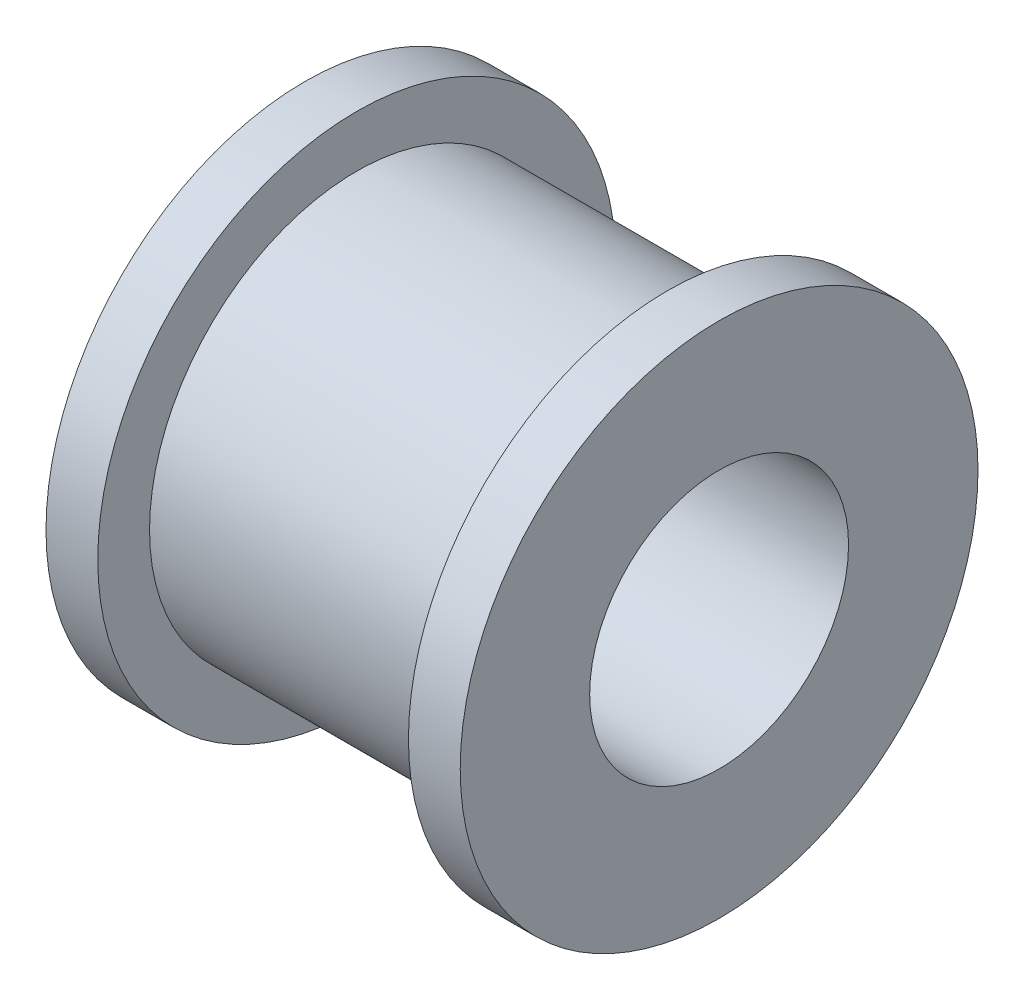
ISO-10303-21;
HEADER;
FILE_DESCRIPTION(('STEP AP214'),'2;1');
FILE_NAME('part.step','',(''),(''),'','','');
FILE_SCHEMA(('AUTOMOTIVE_DESIGN { 1 0 10303 214 1 1 1 1 }'));
ENDSEC;
DATA;
#1=APPLICATION_CONTEXT('core data for automotive mechanical design processes');
#2=APPLICATION_PROTOCOL_DEFINITION('international standard','automotive_design',2000,#1);
#3=PRODUCT_CONTEXT('',#1,'mechanical');
#4=PRODUCT('Part','Part','',(#3));
#5=PRODUCT_RELATED_PRODUCT_CATEGORY('part','',(#4));
#6=PRODUCT_DEFINITION_FORMATION('','',#4);
#7=PRODUCT_DEFINITION_CONTEXT('part definition',#1,'design');
#8=PRODUCT_DEFINITION('design','',#6,#7);
#9=PRODUCT_DEFINITION_SHAPE('','',#8);
#10=(LENGTH_UNIT() NAMED_UNIT(*) SI_UNIT(.MILLI.,.METRE.));
#11=(NAMED_UNIT(*) PLANE_ANGLE_UNIT() SI_UNIT($,.RADIAN.));
#12=(NAMED_UNIT(*) SI_UNIT($,.STERADIAN.) SOLID_ANGLE_UNIT());
#13=UNCERTAINTY_MEASURE_WITH_UNIT(LENGTH_MEASURE(1.E-05),#10,'distance_accuracy_value','');
#14=(GEOMETRIC_REPRESENTATION_CONTEXT(3) GLOBAL_UNCERTAINTY_ASSIGNED_CONTEXT((#13)) GLOBAL_UNIT_ASSIGNED_CONTEXT((#10,
#11,#12)) REPRESENTATION_CONTEXT('',''));
#15=CARTESIAN_POINT('',(0.,0.,0.));
#16=DIRECTION('',(0.,0.,1.));
#17=DIRECTION('',(1.,0.,0.));
#18=AXIS2_PLACEMENT_3D('',#15,#16,#17);
#19=CARTESIAN_POINT('',(8.,0.,0.));
#20=DIRECTION('',(-1.,0.,0.));
#21=DIRECTION('',(0.,0.,1.));
#22=AXIS2_PLACEMENT_3D('',#19,#20,#21);
#23=CYLINDRICAL_SURFACE('',#22,5.);
#24=CARTESIAN_POINT('',(0.,0.,0.));
#25=DIRECTION('',(1.,0.,0.));
#26=DIRECTION('',(0.,0.,-1.));
#27=AXIS2_PLACEMENT_3D('',#24,#25,#26);
#28=CIRCLE('',#27,5.);
#29=CARTESIAN_POINT('',(0.,0.,-5.));
#30=VERTEX_POINT('',#29);
#31=EDGE_CURVE('E45',#30,#30,#28,.T.);
#32=ORIENTED_EDGE('',*,*,#31,.T.);
#33=EDGE_LOOP('',(#32));
#34=FACE_BOUND('',#33,.T.);
#35=CARTESIAN_POINT('',(1.,0.,0.));
#36=DIRECTION('',(1.,0.,0.));
#37=DIRECTION('',(0.,0.,-1.));
#38=AXIS2_PLACEMENT_3D('',#35,#36,#37);
#39=CIRCLE('',#38,5.);
#40=CARTESIAN_POINT('',(1.,0.,-5.));
#41=VERTEX_POINT('',#40);
#42=EDGE_CURVE('E60',#41,#41,#39,.T.);
#43=ORIENTED_EDGE('',*,*,#42,.F.);
#44=EDGE_LOOP('',(#43));
#45=FACE_BOUND('',#44,.T.);
#46=ADVANCED_FACE('F41',(#34,#45),#23,.T.);
#47=CARTESIAN_POINT('',(8.,0.,0.));
#48=DIRECTION('',(1.,0.,0.));
#49=DIRECTION('',(0.,0.,-1.));
#50=AXIS2_PLACEMENT_3D('',#47,#48,#49);
#51=PLANE('',#50);
#52=CARTESIAN_POINT('',(8.,0.,0.));
#53=DIRECTION('',(1.,0.,0.));
#54=DIRECTION('',(0.,0.,-1.));
#55=AXIS2_PLACEMENT_3D('',#52,#53,#54);
#56=CIRCLE('',#55,5.);
#57=CARTESIAN_POINT('',(8.,0.,-5.));
#58=VERTEX_POINT('',#57);
#59=EDGE_CURVE('E10',#58,#58,#56,.T.);
#60=ORIENTED_EDGE('',*,*,#59,.T.);
#61=EDGE_LOOP('',(#60));
#62=FACE_BOUND('',#61,.T.);
#63=CARTESIAN_POINT('',(8.,0.,0.));
#64=DIRECTION('',(1.,0.,0.));
#65=DIRECTION('',(0.,0.,-1.));
#66=AXIS2_PLACEMENT_3D('',#63,#64,#65);
#67=CIRCLE('',#66,2.5);
#68=CARTESIAN_POINT('',(8.,0.,-2.5));
#69=VERTEX_POINT('',#68);
#70=EDGE_CURVE('E54',#69,#69,#67,.T.);
#71=ORIENTED_EDGE('',*,*,#70,.F.);
#72=EDGE_LOOP('',(#71));
#73=FACE_BOUND('',#72,.T.);
#74=ADVANCED_FACE('F92',(#62,#73),#51,.T.);
#75=CARTESIAN_POINT('',(0.,0.,0.));
#76=DIRECTION('',(1.,0.,0.));
#77=DIRECTION('',(0.,0.,-1.));
#78=AXIS2_PLACEMENT_3D('',#75,#76,#77);
#79=PLANE('',#78);
#80=ORIENTED_EDGE('',*,*,#31,.F.);
#81=EDGE_LOOP('',(#80));
#82=FACE_BOUND('',#81,.T.);
#83=CARTESIAN_POINT('',(0.,0.,0.));
#84=DIRECTION('',(1.,0.,0.));
#85=DIRECTION('',(0.,0.,-1.));
#86=AXIS2_PLACEMENT_3D('',#83,#84,#85);
#87=CIRCLE('',#86,2.5);
#88=CARTESIAN_POINT('',(0.,0.,-2.5));
#89=VERTEX_POINT('',#88);
#90=EDGE_CURVE('E56',#89,#89,#87,.T.);
#91=ORIENTED_EDGE('',*,*,#90,.T.);
#92=EDGE_LOOP('',(#91));
#93=FACE_BOUND('',#92,.T.);
#94=ADVANCED_FACE('F97',(#82,#93),#79,.F.);
#95=CARTESIAN_POINT('',(7.,0.,0.));
#96=DIRECTION('',(1.,0.,0.));
#97=DIRECTION('',(0.,0.,-1.));
#98=AXIS2_PLACEMENT_3D('',#95,#96,#97);
#99=CIRCLE('',#98,5.);
#100=CARTESIAN_POINT('',(7.,0.,-5.));
#101=VERTEX_POINT('',#100);
#102=EDGE_CURVE('E64',#101,#101,#99,.T.);
#103=ORIENTED_EDGE('',*,*,#102,.T.);
#104=EDGE_LOOP('',(#103));
#105=FACE_BOUND('',#104,.T.);
#106=ORIENTED_EDGE('',*,*,#59,.F.);
#107=EDGE_LOOP('',(#106));
#108=FACE_BOUND('',#107,.T.);
#109=ADVANCED_FACE('F43',(#105,#108),#23,.T.);
#110=CARTESIAN_POINT('',(8.,0.,0.));
#111=DIRECTION('',(-1.,0.,0.));
#112=DIRECTION('',(0.,0.,1.));
#113=AXIS2_PLACEMENT_3D('',#110,#111,#112);
#114=CYLINDRICAL_SURFACE('',#113,2.5);
#115=ORIENTED_EDGE('',*,*,#70,.T.);
#116=EDGE_LOOP('',(#115));
#117=FACE_BOUND('',#116,.T.);
#118=ORIENTED_EDGE('',*,*,#90,.F.);
#119=EDGE_LOOP('',(#118));
#120=FACE_BOUND('',#119,.T.);
#121=ADVANCED_FACE('F87',(#117,#120),#114,.F.);
#122=CARTESIAN_POINT('',(1.,0.,0.));
#123=DIRECTION('',(1.,0.,0.));
#124=DIRECTION('',(0.,0.,-1.));
#125=AXIS2_PLACEMENT_3D('',#122,#123,#124);
#126=PLANE('',#125);
#127=CARTESIAN_POINT('',(1.,0.,0.));
#128=DIRECTION('',(1.,0.,0.));
#129=DIRECTION('',(0.,0.,-1.));
#130=AXIS2_PLACEMENT_3D('',#127,#128,#129);
#131=CIRCLE('',#130,4.);
#132=CARTESIAN_POINT('',(1.,0.,-4.));
#133=VERTEX_POINT('',#132);
#134=EDGE_CURVE('E68',#133,#133,#131,.T.);
#135=ORIENTED_EDGE('',*,*,#134,.F.);
#136=EDGE_LOOP('',(#135));
#137=FACE_BOUND('',#136,.T.);
#138=ORIENTED_EDGE('',*,*,#42,.T.);
#139=EDGE_LOOP('',(#138));
#140=FACE_BOUND('',#139,.T.);
#141=ADVANCED_FACE('F83',(#137,#140),#126,.T.);
#142=CARTESIAN_POINT('',(7.,0.,0.));
#143=DIRECTION('',(1.,0.,0.));
#144=DIRECTION('',(0.,0.,-1.));
#145=AXIS2_PLACEMENT_3D('',#142,#143,#144);
#146=PLANE('',#145);
#147=CARTESIAN_POINT('',(7.,0.,0.));
#148=DIRECTION('',(1.,0.,0.));
#149=DIRECTION('',(0.,0.,-1.));
#150=AXIS2_PLACEMENT_3D('',#147,#148,#149);
#151=CIRCLE('',#150,4.);
#152=CARTESIAN_POINT('',(7.,0.,-4.));
#153=VERTEX_POINT('',#152);
#154=EDGE_CURVE('E72',#153,#153,#151,.T.);
#155=ORIENTED_EDGE('',*,*,#154,.T.);
#156=EDGE_LOOP('',(#155));
#157=FACE_BOUND('',#156,.T.);
#158=ORIENTED_EDGE('',*,*,#102,.F.);
#159=EDGE_LOOP('',(#158));
#160=FACE_BOUND('',#159,.T.);
#161=ADVANCED_FACE('F86',(#157,#160),#146,.F.);
#162=CARTESIAN_POINT('',(1.,0.,0.));
#163=DIRECTION('',(1.,0.,0.));
#164=DIRECTION('',(0.,0.,-1.));
#165=AXIS2_PLACEMENT_3D('',#162,#163,#164);
#166=CYLINDRICAL_SURFACE('',#165,4.);
#167=ORIENTED_EDGE('',*,*,#134,.T.);
#168=EDGE_LOOP('',(#167));
#169=FACE_BOUND('',#168,.T.);
#170=ORIENTED_EDGE('',*,*,#154,.F.);
#171=EDGE_LOOP('',(#170));
#172=FACE_BOUND('',#171,.T.);
#173=ADVANCED_FACE('F80',(#169,#172),#166,.T.);
#174=CLOSED_SHELL('',(#46,#74,#94,#109,#121,#141,#161,#173));
#175=MANIFOLD_SOLID_BREP('B2',#174);
#176=ADVANCED_BREP_SHAPE_REPRESENTATION('',(#18,#175),#14);
#177=SHAPE_DEFINITION_REPRESENTATION(#9,#176);
ENDSEC;
END-ISO-10303-21;
